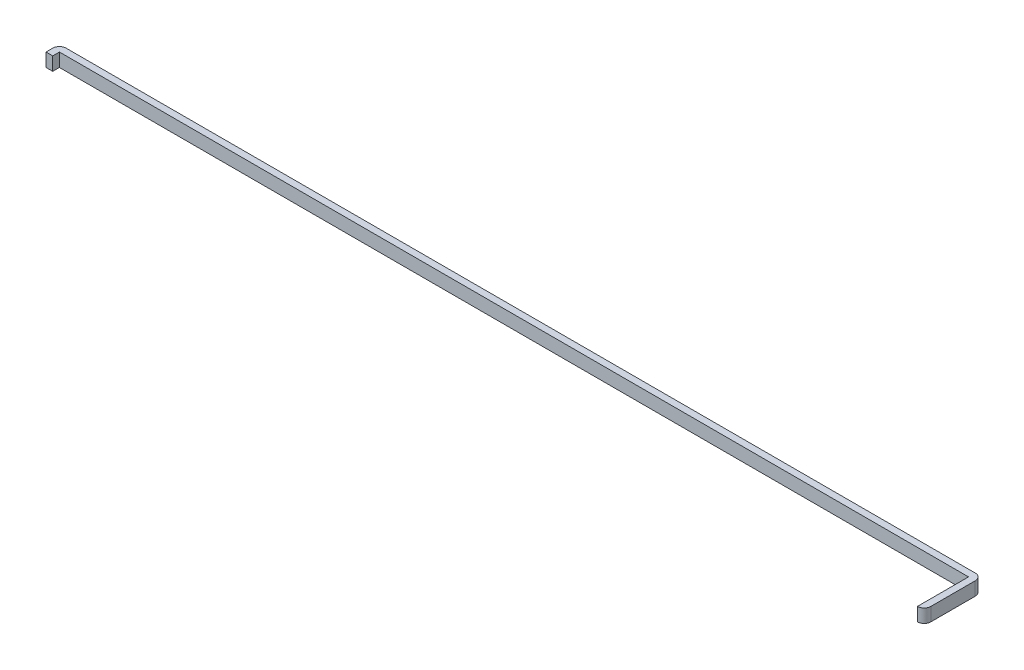
ISO-10303-21;
HEADER;
FILE_DESCRIPTION(('STEP AP214'),'2;1');
FILE_NAME('part.step','',(''),(''),'','','');
FILE_SCHEMA(('AUTOMOTIVE_DESIGN { 1 0 10303 214 1 1 1 1 }'));
ENDSEC;
DATA;
#1=APPLICATION_CONTEXT('core data for automotive mechanical design processes');
#2=APPLICATION_PROTOCOL_DEFINITION('international standard','automotive_design',2000,#1);
#3=PRODUCT_CONTEXT('',#1,'mechanical');
#4=PRODUCT('Part','Part','',(#3));
#5=PRODUCT_RELATED_PRODUCT_CATEGORY('part','',(#4));
#6=PRODUCT_DEFINITION_FORMATION('','',#4);
#7=PRODUCT_DEFINITION_CONTEXT('part definition',#1,'design');
#8=PRODUCT_DEFINITION('design','',#6,#7);
#9=PRODUCT_DEFINITION_SHAPE('','',#8);
#10=(LENGTH_UNIT() NAMED_UNIT(*) SI_UNIT(.MILLI.,.METRE.));
#11=(NAMED_UNIT(*) PLANE_ANGLE_UNIT() SI_UNIT($,.RADIAN.));
#12=(NAMED_UNIT(*) SI_UNIT($,.STERADIAN.) SOLID_ANGLE_UNIT());
#13=UNCERTAINTY_MEASURE_WITH_UNIT(LENGTH_MEASURE(1.E-05),#10,'distance_accuracy_value','');
#14=(GEOMETRIC_REPRESENTATION_CONTEXT(3) GLOBAL_UNCERTAINTY_ASSIGNED_CONTEXT((#13)) GLOBAL_UNIT_ASSIGNED_CONTEXT((#10,
#11,#12)) REPRESENTATION_CONTEXT('',''));
#15=CARTESIAN_POINT('',(0.,0.,0.));
#16=DIRECTION('',(0.,0.,1.));
#17=DIRECTION('',(1.,0.,0.));
#18=AXIS2_PLACEMENT_3D('',#15,#16,#17);
#19=CARTESIAN_POINT('',(-13.566,-5.80619,0.20019));
#20=DIRECTION('',(0.,0.,-1.));
#21=DIRECTION('',(-1.,0.,0.));
#22=AXIS2_PLACEMENT_3D('',#19,#20,#21);
#23=PLANE('',#22);
#24=DIRECTION('',(0.,1.,0.));
#25=VECTOR('',#24,1.);
#26=CARTESIAN_POINT('',(13.576,-5.80619,0.20019));
#27=LINE('',#26,#25);
#28=CARTESIAN_POINT('',(13.576,-5.80619,0.20019));
#29=VERTEX_POINT('',#28);
#30=CARTESIAN_POINT('',(13.576,-5.40581,0.20019));
#31=VERTEX_POINT('',#30);
#32=EDGE_CURVE('E125',#29,#31,#27,.T.);
#33=ORIENTED_EDGE('',*,*,#32,.T.);
#34=DIRECTION('',(1.,0.,0.));
#35=VECTOR('',#34,1.);
#36=CARTESIAN_POINT('',(13.576,-5.40581,0.20019));
#37=LINE('',#36,#35);
#38=CARTESIAN_POINT('',(-13.566,-5.40581,0.20019));
#39=VERTEX_POINT('',#38);
#40=EDGE_CURVE('E112',#31,#39,#37,.F.);
#41=ORIENTED_EDGE('',*,*,#40,.T.);
#42=DIRECTION('',(0.,1.,0.));
#43=VECTOR('',#42,1.);
#44=CARTESIAN_POINT('',(-13.566,-5.80619,0.20019));
#45=LINE('',#44,#43);
#46=CARTESIAN_POINT('',(-13.566,-5.80619,0.20019));
#47=VERTEX_POINT('',#46);
#48=EDGE_CURVE('E108',#39,#47,#45,.F.);
#49=ORIENTED_EDGE('',*,*,#48,.T.);
#50=DIRECTION('',(1.,0.,0.));
#51=VECTOR('',#50,1.);
#52=CARTESIAN_POINT('',(13.576,-5.80619,0.20019));
#53=LINE('',#52,#51);
#54=EDGE_CURVE('E126',#29,#47,#53,.F.);
#55=ORIENTED_EDGE('',*,*,#54,.F.);
#56=EDGE_LOOP('',(#33,#41,#49,#55));
#57=FACE_BOUND('',#56,.T.);
#58=ADVANCED_FACE('F17',(#57),#23,.F.);
#59=CARTESIAN_POINT('',(-13.566,-5.80619,0.40038));
#60=DIRECTION('',(-1.,0.,0.));
#61=DIRECTION('',(0.,0.,1.));
#62=AXIS2_PLACEMENT_3D('',#59,#60,#61);
#63=PLANE('',#62);
#64=ORIENTED_EDGE('',*,*,#48,.F.);
#65=DIRECTION('',(0.,0.,-1.));
#66=VECTOR('',#65,1.);
#67=CARTESIAN_POINT('',(-13.566,-5.40581,0.20019));
#68=LINE('',#67,#66);
#69=CARTESIAN_POINT('',(-13.566,-5.40581,0.40038));
#70=VERTEX_POINT('',#69);
#71=EDGE_CURVE('E120',#39,#70,#68,.F.);
#72=ORIENTED_EDGE('',*,*,#71,.T.);
#73=DIRECTION('',(0.,1.,0.));
#74=VECTOR('',#73,1.);
#75=CARTESIAN_POINT('',(-13.566,-5.80619,0.40038));
#76=LINE('',#75,#74);
#77=CARTESIAN_POINT('',(-13.566,-5.80619,0.40038));
#78=VERTEX_POINT('',#77);
#79=EDGE_CURVE('E177',#70,#78,#76,.F.);
#80=ORIENTED_EDGE('',*,*,#79,.T.);
#81=DIRECTION('',(0.,0.,-1.));
#82=VECTOR('',#81,1.);
#83=CARTESIAN_POINT('',(-13.566,-5.80619,0.20019));
#84=LINE('',#83,#82);
#85=EDGE_CURVE('E168',#47,#78,#84,.F.);
#86=ORIENTED_EDGE('',*,*,#85,.F.);
#87=EDGE_LOOP('',(#64,#72,#80,#86));
#88=FACE_BOUND('',#87,.T.);
#89=ADVANCED_FACE('F227',(#88),#63,.F.);
#90=CARTESIAN_POINT('',(-13.76619,-5.80619,0.40038));
#91=DIRECTION('',(0.,0.,-1.));
#92=DIRECTION('',(-1.,0.,0.));
#93=AXIS2_PLACEMENT_3D('',#90,#91,#92);
#94=PLANE('',#93);
#95=ORIENTED_EDGE('',*,*,#79,.F.);
#96=DIRECTION('',(1.,0.,0.));
#97=VECTOR('',#96,1.);
#98=CARTESIAN_POINT('',(13.576,-5.40581,0.40038));
#99=LINE('',#98,#97);
#100=CARTESIAN_POINT('',(-13.76619,-5.40581,0.40038));
#101=VERTEX_POINT('',#100);
#102=EDGE_CURVE('E145',#70,#101,#99,.F.);
#103=ORIENTED_EDGE('',*,*,#102,.T.);
#104=DIRECTION('',(0.,1.,0.));
#105=VECTOR('',#104,1.);
#106=CARTESIAN_POINT('',(-13.76619,-5.80619,0.40038));
#107=LINE('',#106,#105);
#108=CARTESIAN_POINT('',(-13.76619,-5.80619,0.40038));
#109=VERTEX_POINT('',#108);
#110=EDGE_CURVE('E184',#101,#109,#107,.F.);
#111=ORIENTED_EDGE('',*,*,#110,.T.);
#112=DIRECTION('',(1.,0.,0.));
#113=VECTOR('',#112,1.);
#114=CARTESIAN_POINT('',(13.576,-5.80619,0.40038));
#115=LINE('',#114,#113);
#116=EDGE_CURVE('E86',#78,#109,#115,.F.);
#117=ORIENTED_EDGE('',*,*,#116,.F.);
#118=EDGE_LOOP('',(#95,#103,#111,#117));
#119=FACE_BOUND('',#118,.T.);
#120=ADVANCED_FACE('F226',(#119),#94,.F.);
#121=CARTESIAN_POINT('',(-13.76619,-5.80619,0.20019));
#122=DIRECTION('',(1.,0.,0.));
#123=DIRECTION('',(0.,0.,-1.));
#124=AXIS2_PLACEMENT_3D('',#121,#122,#123);
#125=PLANE('',#124);
#126=ORIENTED_EDGE('',*,*,#110,.F.);
#127=DIRECTION('',(0.,0.,-1.));
#128=VECTOR('',#127,1.);
#129=CARTESIAN_POINT('',(-13.76619,-5.40581,0.20019));
#130=LINE('',#129,#128);
#131=CARTESIAN_POINT('',(-13.76619,-5.40581,0.20019));
#132=VERTEX_POINT('',#131);
#133=EDGE_CURVE('E148',#101,#132,#130,.T.);
#134=ORIENTED_EDGE('',*,*,#133,.T.);
#135=DIRECTION('',(0.,-1.,0.));
#136=VECTOR('',#135,1.);
#137=CARTESIAN_POINT('',(-13.76619,-5.80619,0.20019));
#138=LINE('',#137,#136);
#139=CARTESIAN_POINT('',(-13.76619,-5.80619,0.20019));
#140=VERTEX_POINT('',#139);
#141=EDGE_CURVE('E134',#140,#132,#138,.F.);
#142=ORIENTED_EDGE('',*,*,#141,.F.);
#143=DIRECTION('',(0.,0.,-1.));
#144=VECTOR('',#143,1.);
#145=CARTESIAN_POINT('',(-13.76619,-5.80619,0.20019));
#146=LINE('',#145,#144);
#147=EDGE_CURVE('E80',#109,#140,#146,.T.);
#148=ORIENTED_EDGE('',*,*,#147,.F.);
#149=EDGE_LOOP('',(#126,#134,#142,#148));
#150=FACE_BOUND('',#149,.T.);
#151=ADVANCED_FACE('F224',(#150),#125,.F.);
#152=CARTESIAN_POINT('',(13.77619,-5.80619,1.524905));
#153=DIRECTION('',(-1.,0.,0.));
#154=DIRECTION('',(0.,0.,1.));
#155=AXIS2_PLACEMENT_3D('',#152,#153,#154);
#156=PLANE('',#155);
#157=DIRECTION('',(0.,-1.,0.));
#158=VECTOR('',#157,1.);
#159=CARTESIAN_POINT('',(13.77619,-5.80619,0.20019));
#160=LINE('',#159,#158);
#161=CARTESIAN_POINT('',(13.77619,-5.40581,0.20019));
#162=VERTEX_POINT('',#161);
#163=CARTESIAN_POINT('',(13.77619,-5.80619,0.20019));
#164=VERTEX_POINT('',#163);
#165=EDGE_CURVE('E74',#162,#164,#160,.T.);
#166=ORIENTED_EDGE('',*,*,#165,.F.);
#167=DIRECTION('',(0.,0.,-1.));
#168=VECTOR('',#167,1.);
#169=CARTESIAN_POINT('',(13.77619,-5.40581,0.20019));
#170=LINE('',#169,#168);
#171=CARTESIAN_POINT('',(13.77619,-5.40581,1.524905));
#172=VERTEX_POINT('',#171);
#173=EDGE_CURVE('E139',#162,#172,#170,.F.);
#174=ORIENTED_EDGE('',*,*,#173,.T.);
#175=DIRECTION('',(0.,-1.,0.));
#176=VECTOR('',#175,1.);
#177=CARTESIAN_POINT('',(13.77619,-5.80619,1.524905));
#178=LINE('',#177,#176);
#179=CARTESIAN_POINT('',(13.77619,-5.80619,1.524905));
#180=VERTEX_POINT('',#179);
#181=EDGE_CURVE('E190',#180,#172,#178,.F.);
#182=ORIENTED_EDGE('',*,*,#181,.F.);
#183=DIRECTION('',(0.,0.,-1.));
#184=VECTOR('',#183,1.);
#185=CARTESIAN_POINT('',(13.77619,-5.80619,0.20019));
#186=LINE('',#185,#184);
#187=EDGE_CURVE('E160',#164,#180,#186,.F.);
#188=ORIENTED_EDGE('',*,*,#187,.F.);
#189=EDGE_LOOP('',(#166,#174,#182,#188));
#190=FACE_BOUND('',#189,.T.);
#191=ADVANCED_FACE('F216',(#190),#156,.F.);
#192=CARTESIAN_POINT('',(13.576,-5.80619,1.524905));
#193=DIRECTION('',(0.,-1.,0.));
#194=DIRECTION('',(0.,0.,-1.));
#195=AXIS2_PLACEMENT_3D('',#192,#193,#194);
#196=CYLINDRICAL_SURFACE('',#195,0.20019);
#197=CARTESIAN_POINT('',(13.576,-5.40581,1.524905));
#198=DIRECTION('',(0.,-1.,0.));
#199=DIRECTION('',(0.,0.,-1.));
#200=AXIS2_PLACEMENT_3D('',#197,#198,#199);
#201=CIRCLE('',#200,0.20019);
#202=CARTESIAN_POINT('',(13.576,-5.40581,1.725095));
#203=VERTEX_POINT('',#202);
#204=EDGE_CURVE('E135',#172,#203,#201,.T.);
#205=ORIENTED_EDGE('',*,*,#204,.T.);
#206=DIRECTION('',(0.,1.,0.));
#207=VECTOR('',#206,1.);
#208=CARTESIAN_POINT('',(13.576,-5.80619,1.725095));
#209=LINE('',#208,#207);
#210=CARTESIAN_POINT('',(13.576,-5.80619,1.725095));
#211=VERTEX_POINT('',#210);
#212=EDGE_CURVE('E129',#203,#211,#209,.F.);
#213=ORIENTED_EDGE('',*,*,#212,.T.);
#214=CARTESIAN_POINT('',(13.576,-5.80619,1.524905));
#215=DIRECTION('',(0.,-1.,0.));
#216=DIRECTION('',(0.,0.,-1.));
#217=AXIS2_PLACEMENT_3D('',#214,#215,#216);
#218=CIRCLE('',#217,0.20019);
#219=EDGE_CURVE('E156',#180,#211,#218,.T.);
#220=ORIENTED_EDGE('',*,*,#219,.F.);
#221=ORIENTED_EDGE('',*,*,#181,.T.);
#222=EDGE_LOOP('',(#205,#213,#220,#221));
#223=FACE_BOUND('',#222,.T.);
#224=ADVANCED_FACE('F218',(#223),#196,.T.);
#225=CARTESIAN_POINT('',(13.576,-5.80619,0.20019));
#226=DIRECTION('',(1.,0.,0.));
#227=DIRECTION('',(0.,0.,-1.));
#228=AXIS2_PLACEMENT_3D('',#225,#226,#227);
#229=PLANE('',#228);
#230=DIRECTION('',(0.,0.,-1.));
#231=VECTOR('',#230,1.);
#232=CARTESIAN_POINT('',(13.576,-5.80619,0.20019));
#233=LINE('',#232,#231);
#234=EDGE_CURVE('E159',#211,#29,#233,.T.);
#235=ORIENTED_EDGE('',*,*,#234,.F.);
#236=ORIENTED_EDGE('',*,*,#212,.F.);
#237=DIRECTION('',(0.,0.,-1.));
#238=VECTOR('',#237,1.);
#239=CARTESIAN_POINT('',(13.576,-5.40581,0.20019));
#240=LINE('',#239,#238);
#241=EDGE_CURVE('E117',#203,#31,#240,.T.);
#242=ORIENTED_EDGE('',*,*,#241,.T.);
#243=ORIENTED_EDGE('',*,*,#32,.F.);
#244=EDGE_LOOP('',(#235,#236,#242,#243));
#245=FACE_BOUND('',#244,.T.);
#246=ADVANCED_FACE('F131',(#245),#229,.F.);
#247=CARTESIAN_POINT('',(13.576,-5.80619,0.20019));
#248=DIRECTION('',(0.,-1.,0.));
#249=DIRECTION('',(0.,0.,-1.));
#250=AXIS2_PLACEMENT_3D('',#247,#248,#249);
#251=CYLINDRICAL_SURFACE('',#250,0.20019);
#252=CARTESIAN_POINT('',(13.576,-5.40581,0.20019));
#253=DIRECTION('',(0.,-1.,0.));
#254=DIRECTION('',(0.,0.,-1.));
#255=AXIS2_PLACEMENT_3D('',#252,#253,#254);
#256=CIRCLE('',#255,0.20019);
#257=CARTESIAN_POINT('',(13.576,-5.40581,0.));
#258=VERTEX_POINT('',#257);
#259=EDGE_CURVE('E20',#258,#162,#256,.T.);
#260=ORIENTED_EDGE('',*,*,#259,.T.);
#261=ORIENTED_EDGE('',*,*,#165,.T.);
#262=CARTESIAN_POINT('',(13.576,-5.80619,0.20019));
#263=DIRECTION('',(0.,-1.,0.));
#264=DIRECTION('',(0.,0.,-1.));
#265=AXIS2_PLACEMENT_3D('',#262,#263,#264);
#266=CIRCLE('',#265,0.20019);
#267=CARTESIAN_POINT('',(13.576,-5.80619,0.));
#268=VERTEX_POINT('',#267);
#269=EDGE_CURVE('E161',#268,#164,#266,.T.);
#270=ORIENTED_EDGE('',*,*,#269,.F.);
#271=DIRECTION('',(0.,1.,0.));
#272=VECTOR('',#271,1.);
#273=CARTESIAN_POINT('',(13.576,-5.80619,0.));
#274=LINE('',#273,#272);
#275=EDGE_CURVE('E64',#268,#258,#274,.T.);
#276=ORIENTED_EDGE('',*,*,#275,.T.);
#277=EDGE_LOOP('',(#260,#261,#270,#276));
#278=FACE_BOUND('',#277,.T.);
#279=ADVANCED_FACE('F219',(#278),#251,.T.);
#280=CARTESIAN_POINT('',(13.576,-5.40581,0.20019));
#281=DIRECTION('',(0.,-1.,0.));
#282=DIRECTION('',(0.,0.,-1.));
#283=AXIS2_PLACEMENT_3D('',#280,#281,#282);
#284=PLANE('',#283);
#285=ORIENTED_EDGE('',*,*,#241,.F.);
#286=ORIENTED_EDGE('',*,*,#204,.F.);
#287=ORIENTED_EDGE('',*,*,#173,.F.);
#288=ORIENTED_EDGE('',*,*,#259,.F.);
#289=DIRECTION('',(1.,0.,0.));
#290=VECTOR('',#289,1.);
#291=CARTESIAN_POINT('',(13.576,-5.40581,0.));
#292=LINE('',#291,#290);
#293=CARTESIAN_POINT('',(-13.566,-5.40581,0.));
#294=VERTEX_POINT('',#293);
#295=EDGE_CURVE('E204',#258,#294,#292,.F.);
#296=ORIENTED_EDGE('',*,*,#295,.T.);
#297=CARTESIAN_POINT('',(-13.566,-5.40581,0.20019));
#298=DIRECTION('',(0.,-1.,0.));
#299=DIRECTION('',(0.,0.,-1.));
#300=AXIS2_PLACEMENT_3D('',#297,#298,#299);
#301=CIRCLE('',#300,0.20019);
#302=EDGE_CURVE('E137',#132,#294,#301,.T.);
#303=ORIENTED_EDGE('',*,*,#302,.F.);
#304=ORIENTED_EDGE('',*,*,#133,.F.);
#305=ORIENTED_EDGE('',*,*,#102,.F.);
#306=ORIENTED_EDGE('',*,*,#71,.F.);
#307=ORIENTED_EDGE('',*,*,#40,.F.);
#308=EDGE_LOOP('',(#285,#286,#287,#288,#296,#303,#304,#305,#306,#307));
#309=FACE_BOUND('',#308,.T.);
#310=ADVANCED_FACE('F114',(#309),#284,.F.);
#311=CARTESIAN_POINT('',(-13.566,-5.80619,0.20019));
#312=DIRECTION('',(0.,-1.,0.));
#313=DIRECTION('',(0.,0.,-1.));
#314=AXIS2_PLACEMENT_3D('',#311,#312,#313);
#315=CYLINDRICAL_SURFACE('',#314,0.20019);
#316=ORIENTED_EDGE('',*,*,#302,.T.);
#317=DIRECTION('',(0.,1.,0.));
#318=VECTOR('',#317,1.);
#319=CARTESIAN_POINT('',(-13.566,-5.80619,0.));
#320=LINE('',#319,#318);
#321=CARTESIAN_POINT('',(-13.566,-5.80619,0.));
#322=VERTEX_POINT('',#321);
#323=EDGE_CURVE('E26',#294,#322,#320,.F.);
#324=ORIENTED_EDGE('',*,*,#323,.T.);
#325=CARTESIAN_POINT('',(-13.566,-5.80619,0.20019));
#326=DIRECTION('',(0.,-1.,0.));
#327=DIRECTION('',(0.,0.,-1.));
#328=AXIS2_PLACEMENT_3D('',#325,#326,#327);
#329=CIRCLE('',#328,0.20019);
#330=EDGE_CURVE('E34',#140,#322,#329,.T.);
#331=ORIENTED_EDGE('',*,*,#330,.F.);
#332=ORIENTED_EDGE('',*,*,#141,.T.);
#333=EDGE_LOOP('',(#316,#324,#331,#332));
#334=FACE_BOUND('',#333,.T.);
#335=ADVANCED_FACE('F221',(#334),#315,.T.);
#336=CARTESIAN_POINT('',(13.576,-5.80619,0.20019));
#337=DIRECTION('',(0.,-1.,0.));
#338=DIRECTION('',(0.,0.,-1.));
#339=AXIS2_PLACEMENT_3D('',#336,#337,#338);
#340=PLANE('',#339);
#341=ORIENTED_EDGE('',*,*,#219,.T.);
#342=ORIENTED_EDGE('',*,*,#234,.T.);
#343=ORIENTED_EDGE('',*,*,#54,.T.);
#344=ORIENTED_EDGE('',*,*,#85,.T.);
#345=ORIENTED_EDGE('',*,*,#116,.T.);
#346=ORIENTED_EDGE('',*,*,#147,.T.);
#347=ORIENTED_EDGE('',*,*,#330,.T.);
#348=DIRECTION('',(1.,0.,0.));
#349=VECTOR('',#348,1.);
#350=CARTESIAN_POINT('',(13.576,-5.80619,0.));
#351=LINE('',#350,#349);
#352=EDGE_CURVE('E11',#322,#268,#351,.T.);
#353=ORIENTED_EDGE('',*,*,#352,.T.);
#354=ORIENTED_EDGE('',*,*,#269,.T.);
#355=ORIENTED_EDGE('',*,*,#187,.T.);
#356=EDGE_LOOP('',(#341,#342,#343,#344,#345,#346,#347,#353,#354,#355));
#357=FACE_BOUND('',#356,.T.);
#358=ADVANCED_FACE('F213',(#357),#340,.T.);
#359=CARTESIAN_POINT('',(13.576,-5.80619,0.));
#360=DIRECTION('',(0.,0.,1.));
#361=DIRECTION('',(1.,0.,0.));
#362=AXIS2_PLACEMENT_3D('',#359,#360,#361);
#363=PLANE('',#362);
#364=ORIENTED_EDGE('',*,*,#323,.F.);
#365=ORIENTED_EDGE('',*,*,#295,.F.);
#366=ORIENTED_EDGE('',*,*,#275,.F.);
#367=ORIENTED_EDGE('',*,*,#352,.F.);
#368=EDGE_LOOP('',(#364,#365,#366,#367));
#369=FACE_BOUND('',#368,.T.);
#370=ADVANCED_FACE('F220',(#369),#363,.F.);
#371=CLOSED_SHELL('',(#58,#89,#120,#151,#191,#224,#246,#279,#310,#335,#358,#370));
#372=MANIFOLD_SOLID_BREP('B1',#371);
#373=ADVANCED_BREP_SHAPE_REPRESENTATION('',(#18,#372),#14);
#374=SHAPE_DEFINITION_REPRESENTATION(#9,#373);
ENDSEC;
END-ISO-10303-21;
